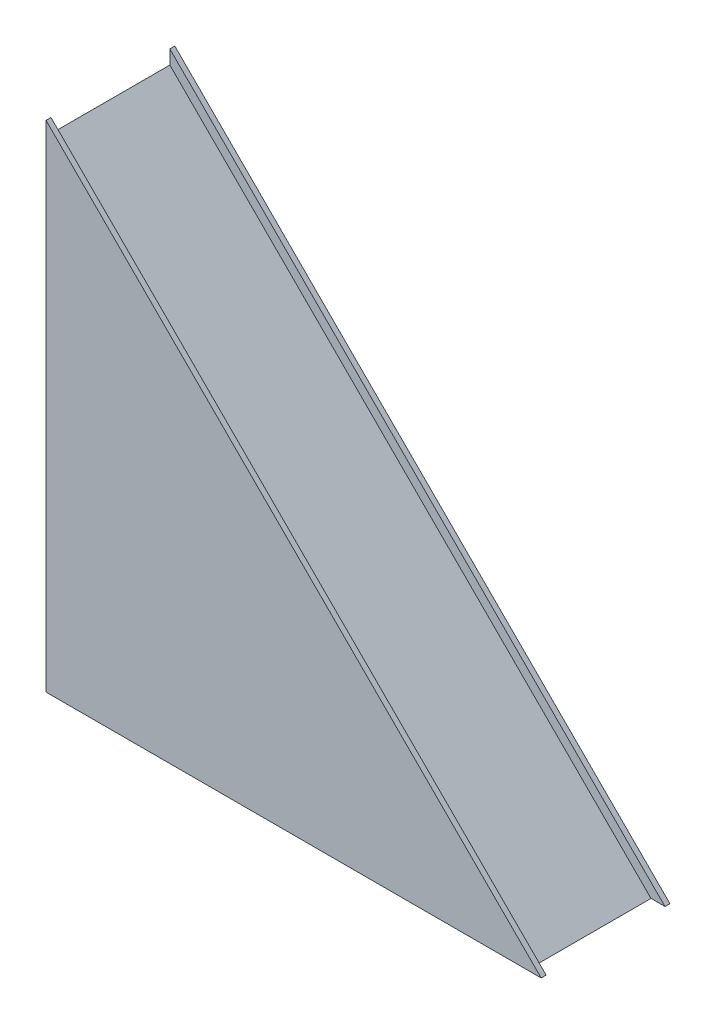
ISO-10303-21;
HEADER;
FILE_DESCRIPTION(('STEP AP214'),'2;1');
FILE_NAME('part.step','',(''),(''),'','','');
FILE_SCHEMA(('AUTOMOTIVE_DESIGN { 1 0 10303 214 1 1 1 1 }'));
ENDSEC;
DATA;
#1=APPLICATION_CONTEXT('core data for automotive mechanical design processes');
#2=APPLICATION_PROTOCOL_DEFINITION('international standard','automotive_design',2000,#1);
#3=PRODUCT_CONTEXT('',#1,'mechanical');
#4=PRODUCT('Part','Part','',(#3));
#5=PRODUCT_RELATED_PRODUCT_CATEGORY('part','',(#4));
#6=PRODUCT_DEFINITION_FORMATION('','',#4);
#7=PRODUCT_DEFINITION_CONTEXT('part definition',#1,'design');
#8=PRODUCT_DEFINITION('design','',#6,#7);
#9=PRODUCT_DEFINITION_SHAPE('','',#8);
#10=(LENGTH_UNIT() NAMED_UNIT(*) SI_UNIT(.MILLI.,.METRE.));
#11=(NAMED_UNIT(*) PLANE_ANGLE_UNIT() SI_UNIT($,.RADIAN.));
#12=(NAMED_UNIT(*) SI_UNIT($,.STERADIAN.) SOLID_ANGLE_UNIT());
#13=UNCERTAINTY_MEASURE_WITH_UNIT(LENGTH_MEASURE(1.E-05),#10,'distance_accuracy_value','');
#14=(GEOMETRIC_REPRESENTATION_CONTEXT(3) GLOBAL_UNCERTAINTY_ASSIGNED_CONTEXT((#13)) GLOBAL_UNIT_ASSIGNED_CONTEXT((#10,
#11,#12)) REPRESENTATION_CONTEXT('',''));
#15=CARTESIAN_POINT('',(0.,0.,0.));
#16=DIRECTION('',(0.,0.,1.));
#17=DIRECTION('',(1.,0.,0.));
#18=AXIS2_PLACEMENT_3D('',#15,#16,#17);
#19=CARTESIAN_POINT('',(0.,2500.00000000003,650.));
#20=DIRECTION('',(-0.707106781186551,-0.707106781186544,0.));
#21=DIRECTION('',(0.707106781186544,-0.707106781186551,0.));
#22=AXIS2_PLACEMENT_3D('',#19,#20,#21);
#23=PLANE('',#22);
#24=DIRECTION('',(0.,0.,-1.));
#25=VECTOR('',#24,1.);
#26=CARTESIAN_POINT('',(0.,2500.00000000003,650.));
#27=LINE('',#26,#25);
#28=CARTESIAN_POINT('',(0.,2500.00000000003,24.9999999999991));
#29=VERTEX_POINT('',#28);
#30=CARTESIAN_POINT('',(0.,2500.00000000003,0.));
#31=VERTEX_POINT('',#30);
#32=EDGE_CURVE('E94',#29,#31,#27,.T.);
#33=ORIENTED_EDGE('',*,*,#32,.F.);
#34=DIRECTION('',(-0.707106781186544,0.707106781186551,0.));
#35=VECTOR('',#34,1.);
#36=CARTESIAN_POINT('',(2500.,8.88178419700125E-13,25.));
#37=LINE('',#36,#35);
#38=CARTESIAN_POINT('',(2500.,8.88178419700125E-13,25.));
#39=VERTEX_POINT('',#38);
#40=EDGE_CURVE('E83',#39,#29,#37,.T.);
#41=ORIENTED_EDGE('',*,*,#40,.F.);
#42=DIRECTION('',(0.,0.,-1.));
#43=VECTOR('',#42,1.);
#44=CARTESIAN_POINT('',(2500.,0.,650.));
#45=LINE('',#44,#43);
#46=CARTESIAN_POINT('',(2500.,0.,0.));
#47=VERTEX_POINT('',#46);
#48=EDGE_CURVE('E104',#39,#47,#45,.T.);
#49=ORIENTED_EDGE('',*,*,#48,.T.);
#50=DIRECTION('',(-0.707106781186544,0.707106781186551,0.));
#51=VECTOR('',#50,1.);
#52=CARTESIAN_POINT('',(0.,2500.00000000003,0.));
#53=LINE('',#52,#51);
#54=EDGE_CURVE('E99',#47,#31,#53,.T.);
#55=ORIENTED_EDGE('',*,*,#54,.T.);
#56=EDGE_LOOP('',(#33,#41,#49,#55));
#57=FACE_BOUND('',#56,.T.);
#58=ADVANCED_FACE('F16',(#57),#23,.F.);
#59=CARTESIAN_POINT('',(0.,0.,650.));
#60=DIRECTION('',(0.,1.,0.));
#61=DIRECTION('',(0.,0.,1.));
#62=AXIS2_PLACEMENT_3D('',#59,#60,#61);
#63=PLANE('',#62);
#64=ORIENTED_EDGE('',*,*,#48,.F.);
#65=DIRECTION('',(-1.,0.,0.));
#66=VECTOR('',#65,1.);
#67=CARTESIAN_POINT('',(1.11022302462515E-13,0.,24.9999999999996));
#68=LINE('',#67,#66);
#69=CARTESIAN_POINT('',(2429.28932188135,-6.66133814775094E-13,25.));
#70=VERTEX_POINT('',#69);
#71=EDGE_CURVE('E87',#39,#70,#68,.T.);
#72=ORIENTED_EDGE('',*,*,#71,.T.);
#73=DIRECTION('',(0.,0.,1.));
#74=VECTOR('',#73,1.);
#75=CARTESIAN_POINT('',(2429.28932188135,0.,649.999999999999));
#76=LINE('',#75,#74);
#77=CARTESIAN_POINT('',(2429.28932188135,-5.55111512312578E-13,625.));
#78=VERTEX_POINT('',#77);
#79=EDGE_CURVE('E123',#70,#78,#76,.T.);
#80=ORIENTED_EDGE('',*,*,#79,.T.);
#81=DIRECTION('',(1.,0.,0.));
#82=VECTOR('',#81,1.);
#83=CARTESIAN_POINT('',(0.,0.,625.));
#84=LINE('',#83,#82);
#85=CARTESIAN_POINT('',(2500.,6.66133814775094E-13,625.));
#86=VERTEX_POINT('',#85);
#87=EDGE_CURVE('E126',#78,#86,#84,.T.);
#88=ORIENTED_EDGE('',*,*,#87,.T.);
#89=CARTESIAN_POINT('',(2500.,0.,650.));
#90=VERTEX_POINT('',#89);
#91=EDGE_CURVE('E108',#90,#86,#45,.T.);
#92=ORIENTED_EDGE('',*,*,#91,.F.);
#93=DIRECTION('',(1.,0.,0.));
#94=VECTOR('',#93,1.);
#95=CARTESIAN_POINT('',(0.,0.,650.));
#96=LINE('',#95,#94);
#97=CARTESIAN_POINT('',(0.,0.,650.));
#98=VERTEX_POINT('',#97);
#99=EDGE_CURVE('E130',#98,#90,#96,.T.);
#100=ORIENTED_EDGE('',*,*,#99,.F.);
#101=DIRECTION('',(0.,0.,-1.));
#102=VECTOR('',#101,1.);
#103=CARTESIAN_POINT('',(0.,0.,650.));
#104=LINE('',#103,#102);
#105=CARTESIAN_POINT('',(0.,0.,0.));
#106=VERTEX_POINT('',#105);
#107=EDGE_CURVE('E101',#98,#106,#104,.T.);
#108=ORIENTED_EDGE('',*,*,#107,.T.);
#109=DIRECTION('',(1.,0.,0.));
#110=VECTOR('',#109,1.);
#111=CARTESIAN_POINT('',(0.,0.,0.));
#112=LINE('',#111,#110);
#113=EDGE_CURVE('E129',#106,#47,#112,.T.);
#114=ORIENTED_EDGE('',*,*,#113,.T.);
#115=EDGE_LOOP('',(#64,#72,#80,#88,#92,#100,#108,#114));
#116=FACE_BOUND('',#115,.T.);
#117=ADVANCED_FACE('F18',(#116),#63,.F.);
#118=ORIENTED_EDGE('',*,*,#91,.T.);
#119=DIRECTION('',(0.707106781186544,-0.707106781186551,0.));
#120=VECTOR('',#119,1.);
#121=CARTESIAN_POINT('',(2500.,6.66133814775094E-13,625.));
#122=LINE('',#121,#120);
#123=CARTESIAN_POINT('',(2.22044604925031E-13,2500.00000000003,625.));
#124=VERTEX_POINT('',#123);
#125=EDGE_CURVE('E91',#124,#86,#122,.T.);
#126=ORIENTED_EDGE('',*,*,#125,.F.);
#127=CARTESIAN_POINT('',(0.,2500.00000000003,650.));
#128=VERTEX_POINT('',#127);
#129=EDGE_CURVE('E100',#128,#124,#27,.T.);
#130=ORIENTED_EDGE('',*,*,#129,.F.);
#131=DIRECTION('',(-0.707106781186544,0.707106781186551,0.));
#132=VECTOR('',#131,1.);
#133=CARTESIAN_POINT('',(0.,2500.00000000003,650.));
#134=LINE('',#133,#132);
#135=EDGE_CURVE('E62',#90,#128,#134,.T.);
#136=ORIENTED_EDGE('',*,*,#135,.F.);
#137=EDGE_LOOP('',(#118,#126,#130,#136));
#138=FACE_BOUND('',#137,.T.);
#139=ADVANCED_FACE('F117',(#138),#23,.F.);
#140=CARTESIAN_POINT('',(0.,0.,650.));
#141=DIRECTION('',(1.,0.,0.));
#142=DIRECTION('',(0.,1.,0.));
#143=AXIS2_PLACEMENT_3D('',#140,#141,#142);
#144=PLANE('',#143);
#145=DIRECTION('',(0.,0.,-1.));
#146=VECTOR('',#145,1.);
#147=CARTESIAN_POINT('',(0.,2429.28932188137,649.999999999999));
#148=LINE('',#147,#146);
#149=CARTESIAN_POINT('',(-4.44089209850063E-13,2429.28932188137,625.));
#150=VERTEX_POINT('',#149);
#151=CARTESIAN_POINT('',(0.,2429.28932188137,24.9999999999991));
#152=VERTEX_POINT('',#151);
#153=EDGE_CURVE('E97',#150,#152,#148,.T.);
#154=ORIENTED_EDGE('',*,*,#153,.T.);
#155=DIRECTION('',(0.,1.,0.));
#156=VECTOR('',#155,1.);
#157=CARTESIAN_POINT('',(0.,-1.11022302462516E-13,24.9999999999996));
#158=LINE('',#157,#156);
#159=EDGE_CURVE('E10',#152,#29,#158,.T.);
#160=ORIENTED_EDGE('',*,*,#159,.T.);
#161=ORIENTED_EDGE('',*,*,#32,.T.);
#162=DIRECTION('',(0.,-1.,0.));
#163=VECTOR('',#162,1.);
#164=CARTESIAN_POINT('',(0.,0.,0.));
#165=LINE('',#164,#163);
#166=EDGE_CURVE('E56',#31,#106,#165,.T.);
#167=ORIENTED_EDGE('',*,*,#166,.T.);
#168=ORIENTED_EDGE('',*,*,#107,.F.);
#169=DIRECTION('',(0.,-1.,0.));
#170=VECTOR('',#169,1.);
#171=CARTESIAN_POINT('',(0.,0.,650.));
#172=LINE('',#171,#170);
#173=EDGE_CURVE('E40',#128,#98,#172,.T.);
#174=ORIENTED_EDGE('',*,*,#173,.F.);
#175=ORIENTED_EDGE('',*,*,#129,.T.);
#176=DIRECTION('',(0.,-1.,0.));
#177=VECTOR('',#176,1.);
#178=CARTESIAN_POINT('',(0.,0.,625.));
#179=LINE('',#178,#177);
#180=EDGE_CURVE('E24',#124,#150,#179,.T.);
#181=ORIENTED_EDGE('',*,*,#180,.T.);
#182=EDGE_LOOP('',(#154,#160,#161,#167,#168,#174,#175,#181));
#183=FACE_BOUND('',#182,.T.);
#184=ADVANCED_FACE('F93',(#183),#144,.F.);
#185=CARTESIAN_POINT('',(0.,0.,650.));
#186=DIRECTION('',(0.,0.,1.));
#187=DIRECTION('',(1.,0.,0.));
#188=AXIS2_PLACEMENT_3D('',#185,#186,#187);
#189=PLANE('',#188);
#190=ORIENTED_EDGE('',*,*,#99,.T.);
#191=ORIENTED_EDGE('',*,*,#135,.T.);
#192=ORIENTED_EDGE('',*,*,#173,.T.);
#193=EDGE_LOOP('',(#190,#191,#192));
#194=FACE_BOUND('',#193,.T.);
#195=ADVANCED_FACE('F142',(#194),#189,.T.);
#196=CARTESIAN_POINT('',(0.,0.,0.));
#197=DIRECTION('',(0.,0.,1.));
#198=DIRECTION('',(1.,0.,0.));
#199=AXIS2_PLACEMENT_3D('',#196,#197,#198);
#200=PLANE('',#199);
#201=ORIENTED_EDGE('',*,*,#113,.F.);
#202=ORIENTED_EDGE('',*,*,#166,.F.);
#203=ORIENTED_EDGE('',*,*,#54,.F.);
#204=EDGE_LOOP('',(#201,#202,#203));
#205=FACE_BOUND('',#204,.T.);
#206=ADVANCED_FACE('F140',(#205),#200,.F.);
#207=CARTESIAN_POINT('',(2464.64466094067,-35.3553390593263,25.));
#208=DIRECTION('',(0.,0.,-1.));
#209=DIRECTION('',(0.,1.,0.));
#210=AXIS2_PLACEMENT_3D('',#207,#208,#209);
#211=PLANE('',#210);
#212=ORIENTED_EDGE('',*,*,#40,.T.);
#213=ORIENTED_EDGE('',*,*,#159,.F.);
#214=DIRECTION('',(-0.707106781186544,0.707106781186551,0.));
#215=VECTOR('',#214,1.);
#216=CARTESIAN_POINT('',(2464.64466094067,-35.3553390593263,25.));
#217=LINE('',#216,#215);
#218=EDGE_CURVE('E31',#70,#152,#217,.T.);
#219=ORIENTED_EDGE('',*,*,#218,.F.);
#220=ORIENTED_EDGE('',*,*,#71,.F.);
#221=EDGE_LOOP('',(#212,#213,#219,#220));
#222=FACE_BOUND('',#221,.T.);
#223=ADVANCED_FACE('F84',(#222),#211,.F.);
#224=CARTESIAN_POINT('',(2464.64466094067,-35.3553390593265,625.));
#225=DIRECTION('',(0.,0.,1.));
#226=DIRECTION('',(1.,0.,0.));
#227=AXIS2_PLACEMENT_3D('',#224,#225,#226);
#228=PLANE('',#227);
#229=DIRECTION('',(0.707106781186544,-0.707106781186551,0.));
#230=VECTOR('',#229,1.);
#231=CARTESIAN_POINT('',(2464.64466094067,-35.3553390593265,625.));
#232=LINE('',#231,#230);
#233=EDGE_CURVE('E116',#150,#78,#232,.T.);
#234=ORIENTED_EDGE('',*,*,#233,.F.);
#235=ORIENTED_EDGE('',*,*,#180,.F.);
#236=ORIENTED_EDGE('',*,*,#125,.T.);
#237=ORIENTED_EDGE('',*,*,#87,.F.);
#238=EDGE_LOOP('',(#234,#235,#236,#237));
#239=FACE_BOUND('',#238,.T.);
#240=ADVANCED_FACE('F113',(#239),#228,.F.);
#241=CARTESIAN_POINT('',(1214.64466094069,1214.64466094067,-4.62592926927153E-13));
#242=DIRECTION('',(-0.707106781186551,-0.707106781186544,0.));
#243=DIRECTION('',(0.707106781186544,-0.707106781186551,0.));
#244=AXIS2_PLACEMENT_3D('',#241,#242,#243);
#245=PLANE('',#244);
#246=ORIENTED_EDGE('',*,*,#218,.T.);
#247=ORIENTED_EDGE('',*,*,#153,.F.);
#248=ORIENTED_EDGE('',*,*,#233,.T.);
#249=ORIENTED_EDGE('',*,*,#79,.F.);
#250=EDGE_LOOP('',(#246,#247,#248,#249));
#251=FACE_BOUND('',#250,.T.);
#252=ADVANCED_FACE('F193',(#251),#245,.F.);
#253=CLOSED_SHELL('',(#58,#117,#139,#184,#195,#206,#223,#240,#252));
#254=MANIFOLD_SOLID_BREP('B1',#253);
#255=ADVANCED_BREP_SHAPE_REPRESENTATION('',(#18,#254),#14);
#256=SHAPE_DEFINITION_REPRESENTATION(#9,#255);
ENDSEC;
END-ISO-10303-21;
